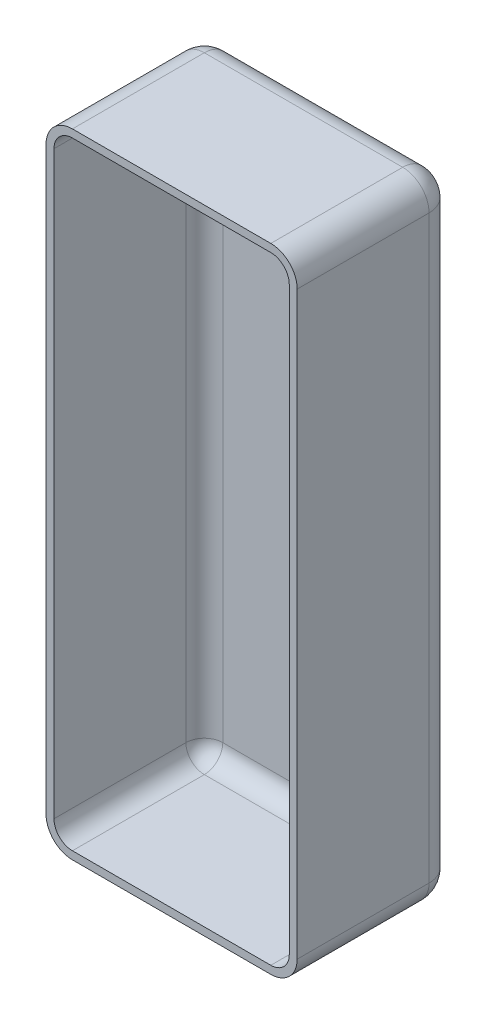
ISO-10303-21;
HEADER;
FILE_DESCRIPTION(('STEP AP214'),'2;1');
FILE_NAME('part.step','',(''),(''),'','','');
FILE_SCHEMA(('AUTOMOTIVE_DESIGN { 1 0 10303 214 1 1 1 1 }'));
ENDSEC;
DATA;
#1=APPLICATION_CONTEXT('core data for automotive mechanical design processes');
#2=APPLICATION_PROTOCOL_DEFINITION('international standard','automotive_design',2000,#1);
#3=PRODUCT_CONTEXT('',#1,'mechanical');
#4=PRODUCT('Part','Part','',(#3));
#5=PRODUCT_RELATED_PRODUCT_CATEGORY('part','',(#4));
#6=PRODUCT_DEFINITION_FORMATION('','',#4);
#7=PRODUCT_DEFINITION_CONTEXT('part definition',#1,'design');
#8=PRODUCT_DEFINITION('design','',#6,#7);
#9=PRODUCT_DEFINITION_SHAPE('','',#8);
#10=(LENGTH_UNIT() NAMED_UNIT(*) SI_UNIT(.MILLI.,.METRE.));
#11=(NAMED_UNIT(*) PLANE_ANGLE_UNIT() SI_UNIT($,.RADIAN.));
#12=(NAMED_UNIT(*) SI_UNIT($,.STERADIAN.) SOLID_ANGLE_UNIT());
#13=UNCERTAINTY_MEASURE_WITH_UNIT(LENGTH_MEASURE(1.E-05),#10,'distance_accuracy_value','');
#14=(GEOMETRIC_REPRESENTATION_CONTEXT(3) GLOBAL_UNCERTAINTY_ASSIGNED_CONTEXT((#13)) GLOBAL_UNIT_ASSIGNED_CONTEXT((#10,
#11,#12)) REPRESENTATION_CONTEXT('',''));
#15=CARTESIAN_POINT('',(0.,0.,0.));
#16=DIRECTION('',(0.,0.,1.));
#17=DIRECTION('',(1.,0.,0.));
#18=AXIS2_PLACEMENT_3D('',#15,#16,#17);
#19=CARTESIAN_POINT('',(-47.6,120.,60.));
#20=DIRECTION('',(1.,0.,0.));
#21=DIRECTION('',(0.,1.,0.));
#22=AXIS2_PLACEMENT_3D('',#19,#20,#21);
#23=PLANE('',#22);
#24=DIRECTION('',(0.,-1.,0.));
#25=VECTOR('',#24,1.);
#26=CARTESIAN_POINT('',(-47.6,120.,10.));
#27=LINE('',#26,#25);
#28=CARTESIAN_POINT('',(-47.6,110.,10.));
#29=VERTEX_POINT('',#28);
#30=CARTESIAN_POINT('',(-47.6,-110.,10.));
#31=VERTEX_POINT('',#30);
#32=EDGE_CURVE('E58',#29,#31,#27,.T.);
#33=ORIENTED_EDGE('',*,*,#32,.T.);
#34=DIRECTION('',(0.,0.,-1.));
#35=VECTOR('',#34,1.);
#36=CARTESIAN_POINT('',(-47.6,-110.,60.));
#37=LINE('',#36,#35);
#38=CARTESIAN_POINT('',(-47.6,-110.,60.));
#39=VERTEX_POINT('',#38);
#40=EDGE_CURVE('E286',#31,#39,#37,.F.);
#41=ORIENTED_EDGE('',*,*,#40,.T.);
#42=DIRECTION('',(0.,-1.,0.));
#43=VECTOR('',#42,1.);
#44=CARTESIAN_POINT('',(-47.6,120.,60.));
#45=LINE('',#44,#43);
#46=CARTESIAN_POINT('',(-47.6,110.,60.));
#47=VERTEX_POINT('',#46);
#48=EDGE_CURVE('E243',#47,#39,#45,.T.);
#49=ORIENTED_EDGE('',*,*,#48,.F.);
#50=DIRECTION('',(0.,0.,-1.));
#51=VECTOR('',#50,1.);
#52=CARTESIAN_POINT('',(-47.6,110.,60.));
#53=LINE('',#52,#51);
#54=EDGE_CURVE('E283',#47,#29,#53,.T.);
#55=ORIENTED_EDGE('',*,*,#54,.T.);
#56=EDGE_LOOP('',(#33,#41,#49,#55));
#57=FACE_BOUND('',#56,.T.);
#58=ADVANCED_FACE('F33',(#57),#23,.F.);
#59=CARTESIAN_POINT('',(-47.6,-120.,60.));
#60=DIRECTION('',(0.,1.,0.));
#61=DIRECTION('',(-1.,0.,0.));
#62=AXIS2_PLACEMENT_3D('',#59,#60,#61);
#63=PLANE('',#62);
#64=DIRECTION('',(1.,0.,0.));
#65=VECTOR('',#64,1.);
#66=CARTESIAN_POINT('',(-47.6,-120.,60.));
#67=LINE('',#66,#65);
#68=CARTESIAN_POINT('',(-37.6,-120.,60.));
#69=VERTEX_POINT('',#68);
#70=CARTESIAN_POINT('',(37.6,-120.,60.));
#71=VERTEX_POINT('',#70);
#72=EDGE_CURVE('E246',#69,#71,#67,.T.);
#73=ORIENTED_EDGE('',*,*,#72,.F.);
#74=DIRECTION('',(0.,0.,-1.));
#75=VECTOR('',#74,1.);
#76=CARTESIAN_POINT('',(-37.6,-120.,60.));
#77=LINE('',#76,#75);
#78=CARTESIAN_POINT('',(-37.6,-120.,10.));
#79=VERTEX_POINT('',#78);
#80=EDGE_CURVE('E260',#69,#79,#77,.T.);
#81=ORIENTED_EDGE('',*,*,#80,.T.);
#82=DIRECTION('',(1.,0.,0.));
#83=VECTOR('',#82,1.);
#84=CARTESIAN_POINT('',(-47.6,-120.,10.));
#85=LINE('',#84,#83);
#86=CARTESIAN_POINT('',(37.6,-120.,10.));
#87=VERTEX_POINT('',#86);
#88=EDGE_CURVE('E257',#79,#87,#85,.T.);
#89=ORIENTED_EDGE('',*,*,#88,.T.);
#90=DIRECTION('',(0.,0.,-1.));
#91=VECTOR('',#90,1.);
#92=CARTESIAN_POINT('',(37.6,-120.,60.));
#93=LINE('',#92,#91);
#94=EDGE_CURVE('E255',#87,#71,#93,.F.);
#95=ORIENTED_EDGE('',*,*,#94,.T.);
#96=EDGE_LOOP('',(#73,#81,#89,#95));
#97=FACE_BOUND('',#96,.T.);
#98=ADVANCED_FACE('F385',(#97),#63,.F.);
#99=CARTESIAN_POINT('',(47.6,120.,60.));
#100=DIRECTION('',(-1.,0.,0.));
#101=DIRECTION('',(0.,-1.,0.));
#102=AXIS2_PLACEMENT_3D('',#99,#100,#101);
#103=PLANE('',#102);
#104=DIRECTION('',(0.,1.,0.));
#105=VECTOR('',#104,1.);
#106=CARTESIAN_POINT('',(47.6,120.,60.));
#107=LINE('',#106,#105);
#108=CARTESIAN_POINT('',(47.6,-110.,60.));
#109=VERTEX_POINT('',#108);
#110=CARTESIAN_POINT('',(47.6,110.,60.));
#111=VERTEX_POINT('',#110);
#112=EDGE_CURVE('E249',#109,#111,#107,.T.);
#113=ORIENTED_EDGE('',*,*,#112,.F.);
#114=DIRECTION('',(0.,0.,-1.));
#115=VECTOR('',#114,1.);
#116=CARTESIAN_POINT('',(47.6,-110.,60.));
#117=LINE('',#116,#115);
#118=CARTESIAN_POINT('',(47.6,-110.,10.));
#119=VERTEX_POINT('',#118);
#120=EDGE_CURVE('E281',#109,#119,#117,.T.);
#121=ORIENTED_EDGE('',*,*,#120,.T.);
#122=DIRECTION('',(0.,1.,0.));
#123=VECTOR('',#122,1.);
#124=CARTESIAN_POINT('',(47.6,120.,10.));
#125=LINE('',#124,#123);
#126=CARTESIAN_POINT('',(47.6,110.,10.));
#127=VERTEX_POINT('',#126);
#128=EDGE_CURVE('E279',#119,#127,#125,.T.);
#129=ORIENTED_EDGE('',*,*,#128,.T.);
#130=DIRECTION('',(0.,0.,-1.));
#131=VECTOR('',#130,1.);
#132=CARTESIAN_POINT('',(47.6,110.,60.));
#133=LINE('',#132,#131);
#134=EDGE_CURVE('E277',#127,#111,#133,.F.);
#135=ORIENTED_EDGE('',*,*,#134,.T.);
#136=EDGE_LOOP('',(#113,#121,#129,#135));
#137=FACE_BOUND('',#136,.T.);
#138=ADVANCED_FACE('F388',(#137),#103,.F.);
#139=CARTESIAN_POINT('',(-47.6,120.,60.));
#140=DIRECTION('',(0.,-1.,0.));
#141=DIRECTION('',(0.,0.,-1.));
#142=AXIS2_PLACEMENT_3D('',#139,#140,#141);
#143=PLANE('',#142);
#144=DIRECTION('',(-1.,0.,0.));
#145=VECTOR('',#144,1.);
#146=CARTESIAN_POINT('',(-47.6,120.,10.));
#147=LINE('',#146,#145);
#148=CARTESIAN_POINT('',(37.6,120.,10.));
#149=VERTEX_POINT('',#148);
#150=CARTESIAN_POINT('',(-37.6,120.,10.));
#151=VERTEX_POINT('',#150);
#152=EDGE_CURVE('E273',#149,#151,#147,.T.);
#153=ORIENTED_EDGE('',*,*,#152,.T.);
#154=DIRECTION('',(0.,0.,-1.));
#155=VECTOR('',#154,1.);
#156=CARTESIAN_POINT('',(-37.6,120.,60.));
#157=LINE('',#156,#155);
#158=CARTESIAN_POINT('',(-37.6,120.,60.));
#159=VERTEX_POINT('',#158);
#160=EDGE_CURVE('E275',#151,#159,#157,.F.);
#161=ORIENTED_EDGE('',*,*,#160,.T.);
#162=DIRECTION('',(-1.,0.,0.));
#163=VECTOR('',#162,1.);
#164=CARTESIAN_POINT('',(-47.6,120.,60.));
#165=LINE('',#164,#163);
#166=CARTESIAN_POINT('',(37.6,120.,60.));
#167=VERTEX_POINT('',#166);
#168=EDGE_CURVE('E252',#167,#159,#165,.T.);
#169=ORIENTED_EDGE('',*,*,#168,.F.);
#170=DIRECTION('',(0.,0.,-1.));
#171=VECTOR('',#170,1.);
#172=CARTESIAN_POINT('',(37.6,120.,60.));
#173=LINE('',#172,#171);
#174=EDGE_CURVE('E271',#167,#149,#173,.T.);
#175=ORIENTED_EDGE('',*,*,#174,.T.);
#176=EDGE_LOOP('',(#153,#161,#169,#175));
#177=FACE_BOUND('',#176,.T.);
#178=ADVANCED_FACE('F353',(#177),#143,.F.);
#179=CARTESIAN_POINT('',(0.,0.,60.));
#180=DIRECTION('',(0.,0.,1.));
#181=DIRECTION('',(1.,0.,0.));
#182=AXIS2_PLACEMENT_3D('',#179,#180,#181);
#183=PLANE('',#182);
#184=DIRECTION('',(0.,-1.,0.));
#185=VECTOR('',#184,1.);
#186=CARTESIAN_POINT('',(-44.6,120.,60.));
#187=LINE('',#186,#185);
#188=CARTESIAN_POINT('',(-44.6,110.,60.));
#189=VERTEX_POINT('',#188);
#190=CARTESIAN_POINT('',(-44.6,-110.,60.));
#191=VERTEX_POINT('',#190);
#192=EDGE_CURVE('E190',#189,#191,#187,.T.);
#193=ORIENTED_EDGE('',*,*,#192,.F.);
#194=CARTESIAN_POINT('',(-37.6,110.,60.));
#195=DIRECTION('',(0.,0.,1.));
#196=DIRECTION('',(1.,0.,0.));
#197=AXIS2_PLACEMENT_3D('',#194,#195,#196);
#198=CIRCLE('',#197,7.);
#199=CARTESIAN_POINT('',(-37.6,117.,60.));
#200=VERTEX_POINT('',#199);
#201=EDGE_CURVE('E237',#200,#189,#198,.T.);
#202=ORIENTED_EDGE('',*,*,#201,.F.);
#203=DIRECTION('',(-1.,0.,0.));
#204=VECTOR('',#203,1.);
#205=CARTESIAN_POINT('',(-47.6,117.,60.));
#206=LINE('',#205,#204);
#207=CARTESIAN_POINT('',(37.6,117.,60.));
#208=VERTEX_POINT('',#207);
#209=EDGE_CURVE('E50',#208,#200,#206,.T.);
#210=ORIENTED_EDGE('',*,*,#209,.F.);
#211=CARTESIAN_POINT('',(37.6,110.,60.));
#212=DIRECTION('',(0.,0.,1.));
#213=DIRECTION('',(1.,0.,0.));
#214=AXIS2_PLACEMENT_3D('',#211,#212,#213);
#215=CIRCLE('',#214,7.);
#216=CARTESIAN_POINT('',(44.6,110.,60.));
#217=VERTEX_POINT('',#216);
#218=EDGE_CURVE('E194',#217,#208,#215,.T.);
#219=ORIENTED_EDGE('',*,*,#218,.F.);
#220=DIRECTION('',(0.,1.,0.));
#221=VECTOR('',#220,1.);
#222=CARTESIAN_POINT('',(44.6,120.,60.));
#223=LINE('',#222,#221);
#224=CARTESIAN_POINT('',(44.6,-110.,60.));
#225=VERTEX_POINT('',#224);
#226=EDGE_CURVE('E235',#225,#217,#223,.T.);
#227=ORIENTED_EDGE('',*,*,#226,.F.);
#228=CARTESIAN_POINT('',(37.6,-110.,60.));
#229=DIRECTION('',(0.,0.,1.));
#230=DIRECTION('',(1.,0.,0.));
#231=AXIS2_PLACEMENT_3D('',#228,#229,#230);
#232=CIRCLE('',#231,7.);
#233=CARTESIAN_POINT('',(37.6,-117.,60.));
#234=VERTEX_POINT('',#233);
#235=EDGE_CURVE('E232',#234,#225,#232,.T.);
#236=ORIENTED_EDGE('',*,*,#235,.F.);
#237=DIRECTION('',(1.,0.,0.));
#238=VECTOR('',#237,1.);
#239=CARTESIAN_POINT('',(-47.6,-117.,60.));
#240=LINE('',#239,#238);
#241=CARTESIAN_POINT('',(-37.6,-117.,60.));
#242=VERTEX_POINT('',#241);
#243=EDGE_CURVE('E227',#242,#234,#240,.T.);
#244=ORIENTED_EDGE('',*,*,#243,.F.);
#245=CARTESIAN_POINT('',(-37.6,-110.,60.));
#246=DIRECTION('',(0.,0.,1.));
#247=DIRECTION('',(1.,0.,0.));
#248=AXIS2_PLACEMENT_3D('',#245,#246,#247);
#249=CIRCLE('',#248,7.);
#250=EDGE_CURVE('E229',#191,#242,#249,.T.);
#251=ORIENTED_EDGE('',*,*,#250,.F.);
#252=EDGE_LOOP('',(#193,#202,#210,#219,#227,#236,#244,#251));
#253=FACE_BOUND('',#252,.T.);
#254=ORIENTED_EDGE('',*,*,#48,.T.);
#255=CARTESIAN_POINT('',(-37.6,-110.,60.));
#256=DIRECTION('',(0.,0.,1.));
#257=DIRECTION('',(1.,0.,0.));
#258=AXIS2_PLACEMENT_3D('',#255,#256,#257);
#259=CIRCLE('',#258,10.);
#260=EDGE_CURVE('E11',#39,#69,#259,.T.);
#261=ORIENTED_EDGE('',*,*,#260,.T.);
#262=ORIENTED_EDGE('',*,*,#72,.T.);
#263=CARTESIAN_POINT('',(37.6,-110.,60.));
#264=DIRECTION('',(0.,0.,1.));
#265=DIRECTION('',(1.,0.,0.));
#266=AXIS2_PLACEMENT_3D('',#263,#264,#265);
#267=CIRCLE('',#266,10.);
#268=EDGE_CURVE('E42',#71,#109,#267,.T.);
#269=ORIENTED_EDGE('',*,*,#268,.T.);
#270=ORIENTED_EDGE('',*,*,#112,.T.);
#271=CARTESIAN_POINT('',(37.6,110.,60.));
#272=DIRECTION('',(0.,0.,1.));
#273=DIRECTION('',(1.,0.,0.));
#274=AXIS2_PLACEMENT_3D('',#271,#272,#273);
#275=CIRCLE('',#274,10.);
#276=EDGE_CURVE('E288',#111,#167,#275,.T.);
#277=ORIENTED_EDGE('',*,*,#276,.T.);
#278=ORIENTED_EDGE('',*,*,#168,.T.);
#279=CARTESIAN_POINT('',(-37.6,110.,60.));
#280=DIRECTION('',(0.,0.,1.));
#281=DIRECTION('',(1.,0.,0.));
#282=AXIS2_PLACEMENT_3D('',#279,#280,#281);
#283=CIRCLE('',#282,10.);
#284=EDGE_CURVE('E290',#159,#47,#283,.T.);
#285=ORIENTED_EDGE('',*,*,#284,.T.);
#286=EDGE_LOOP('',(#254,#261,#262,#269,#270,#277,#278,#285));
#287=FACE_BOUND('',#286,.T.);
#288=ADVANCED_FACE('F346',(#253,#287),#183,.T.);
#289=CARTESIAN_POINT('',(0.,0.,0.));
#290=DIRECTION('',(0.,0.,1.));
#291=DIRECTION('',(1.,0.,0.));
#292=AXIS2_PLACEMENT_3D('',#289,#290,#291);
#293=PLANE('',#292);
#294=DIRECTION('',(-1.,0.,0.));
#295=VECTOR('',#294,1.);
#296=CARTESIAN_POINT('',(0.,110.,0.));
#297=LINE('',#296,#295);
#298=CARTESIAN_POINT('',(-37.6,110.,0.));
#299=VERTEX_POINT('',#298);
#300=CARTESIAN_POINT('',(37.6,110.,0.));
#301=VERTEX_POINT('',#300);
#302=EDGE_CURVE('E264',#299,#301,#297,.F.);
#303=ORIENTED_EDGE('',*,*,#302,.T.);
#304=DIRECTION('',(0.,1.,0.));
#305=VECTOR('',#304,1.);
#306=CARTESIAN_POINT('',(37.6,0.,0.));
#307=LINE('',#306,#305);
#308=CARTESIAN_POINT('',(37.6,-110.,0.));
#309=VERTEX_POINT('',#308);
#310=EDGE_CURVE('E269',#301,#309,#307,.F.);
#311=ORIENTED_EDGE('',*,*,#310,.T.);
#312=DIRECTION('',(1.,0.,0.));
#313=VECTOR('',#312,1.);
#314=CARTESIAN_POINT('',(0.,-110.,0.));
#315=LINE('',#314,#313);
#316=CARTESIAN_POINT('',(-37.6,-110.,0.));
#317=VERTEX_POINT('',#316);
#318=EDGE_CURVE('E266',#309,#317,#315,.F.);
#319=ORIENTED_EDGE('',*,*,#318,.T.);
#320=DIRECTION('',(0.,-1.,0.));
#321=VECTOR('',#320,1.);
#322=CARTESIAN_POINT('',(-37.6,0.,0.));
#323=LINE('',#322,#321);
#324=EDGE_CURVE('E262',#317,#299,#323,.F.);
#325=ORIENTED_EDGE('',*,*,#324,.T.);
#326=EDGE_LOOP('',(#303,#311,#319,#325));
#327=FACE_BOUND('',#326,.T.);
#328=ADVANCED_FACE('F372',(#327),#293,.F.);
#329=CARTESIAN_POINT('',(-37.6,110.,60.));
#330=DIRECTION('',(0.,0.,-1.));
#331=DIRECTION('',(-1.,0.,0.));
#332=AXIS2_PLACEMENT_3D('',#329,#330,#331);
#333=CYLINDRICAL_SURFACE('',#332,10.);
#334=ORIENTED_EDGE('',*,*,#284,.F.);
#335=ORIENTED_EDGE('',*,*,#160,.F.);
#336=CARTESIAN_POINT('',(-37.6,110.,10.));
#337=DIRECTION('',(0.,0.,-1.));
#338=DIRECTION('',(-1.,0.,0.));
#339=AXIS2_PLACEMENT_3D('',#336,#337,#338);
#340=CIRCLE('',#339,10.);
#341=EDGE_CURVE('E319',#29,#151,#340,.T.);
#342=ORIENTED_EDGE('',*,*,#341,.F.);
#343=ORIENTED_EDGE('',*,*,#54,.F.);
#344=EDGE_LOOP('',(#334,#335,#342,#343));
#345=FACE_BOUND('',#344,.T.);
#346=ADVANCED_FACE('F35',(#345),#333,.T.);
#347=CARTESIAN_POINT('',(37.6,110.,60.));
#348=DIRECTION('',(0.,0.,-1.));
#349=DIRECTION('',(-1.,0.,0.));
#350=AXIS2_PLACEMENT_3D('',#347,#348,#349);
#351=CYLINDRICAL_SURFACE('',#350,10.);
#352=ORIENTED_EDGE('',*,*,#276,.F.);
#353=ORIENTED_EDGE('',*,*,#134,.F.);
#354=CARTESIAN_POINT('',(37.6,110.,10.));
#355=DIRECTION('',(0.,0.,-1.));
#356=DIRECTION('',(-1.,0.,0.));
#357=AXIS2_PLACEMENT_3D('',#354,#355,#356);
#358=CIRCLE('',#357,10.);
#359=EDGE_CURVE('E317',#149,#127,#358,.T.);
#360=ORIENTED_EDGE('',*,*,#359,.F.);
#361=ORIENTED_EDGE('',*,*,#174,.F.);
#362=EDGE_LOOP('',(#352,#353,#360,#361));
#363=FACE_BOUND('',#362,.T.);
#364=ADVANCED_FACE('F362',(#363),#351,.T.);
#365=CARTESIAN_POINT('',(-47.6,110.,10.));
#366=DIRECTION('',(-1.,0.,0.));
#367=DIRECTION('',(0.,0.,1.));
#368=AXIS2_PLACEMENT_3D('',#365,#366,#367);
#369=CYLINDRICAL_SURFACE('',#368,10.);
#370=CARTESIAN_POINT('',(-37.6,110.,10.));
#371=DIRECTION('',(-1.,0.,0.));
#372=DIRECTION('',(0.,0.,1.));
#373=AXIS2_PLACEMENT_3D('',#370,#371,#372);
#374=CIRCLE('',#373,10.);
#375=EDGE_CURVE('E37',#151,#299,#374,.T.);
#376=ORIENTED_EDGE('',*,*,#375,.F.);
#377=ORIENTED_EDGE('',*,*,#152,.F.);
#378=CARTESIAN_POINT('',(37.6,110.,10.));
#379=DIRECTION('',(1.,0.,0.));
#380=DIRECTION('',(0.,1.,0.));
#381=AXIS2_PLACEMENT_3D('',#378,#379,#380);
#382=CIRCLE('',#381,10.);
#383=EDGE_CURVE('E314',#301,#149,#382,.T.);
#384=ORIENTED_EDGE('',*,*,#383,.F.);
#385=ORIENTED_EDGE('',*,*,#302,.F.);
#386=EDGE_LOOP('',(#376,#377,#384,#385));
#387=FACE_BOUND('',#386,.T.);
#388=ADVANCED_FACE('F357',(#387),#369,.T.);
#389=CARTESIAN_POINT('',(-37.6,110.,10.));
#390=DIRECTION('',(0.,0.,1.));
#391=DIRECTION('',(1.,0.,0.));
#392=AXIS2_PLACEMENT_3D('',#389,#390,#391);
#393=SPHERICAL_SURFACE('',#392,10.);
#394=ORIENTED_EDGE('',*,*,#341,.T.);
#395=ORIENTED_EDGE('',*,*,#375,.T.);
#396=CARTESIAN_POINT('',(-37.6,110.,10.));
#397=DIRECTION('',(0.,1.,0.));
#398=DIRECTION('',(0.,0.,1.));
#399=AXIS2_PLACEMENT_3D('',#396,#397,#398);
#400=CIRCLE('',#399,10.);
#401=EDGE_CURVE('E311',#29,#299,#400,.F.);
#402=ORIENTED_EDGE('',*,*,#401,.F.);
#403=EDGE_LOOP('',(#394,#395,#402));
#404=FACE_BOUND('',#403,.T.);
#405=ADVANCED_FACE('F326',(#404),#393,.T.);
#406=CARTESIAN_POINT('',(37.6,110.,10.));
#407=DIRECTION('',(0.,0.,1.));
#408=DIRECTION('',(1.,0.,0.));
#409=AXIS2_PLACEMENT_3D('',#406,#407,#408);
#410=SPHERICAL_SURFACE('',#409,10.);
#411=ORIENTED_EDGE('',*,*,#383,.T.);
#412=ORIENTED_EDGE('',*,*,#359,.T.);
#413=CARTESIAN_POINT('',(37.6,110.,10.));
#414=DIRECTION('',(0.,1.,0.));
#415=DIRECTION('',(0.,0.,1.));
#416=AXIS2_PLACEMENT_3D('',#413,#414,#415);
#417=CIRCLE('',#416,10.);
#418=EDGE_CURVE('E308',#301,#127,#417,.F.);
#419=ORIENTED_EDGE('',*,*,#418,.F.);
#420=EDGE_LOOP('',(#411,#412,#419));
#421=FACE_BOUND('',#420,.T.);
#422=ADVANCED_FACE('F364',(#421),#410,.T.);
#423=CARTESIAN_POINT('',(-37.6,120.,10.));
#424=DIRECTION('',(0.,-1.,0.));
#425=DIRECTION('',(1.,0.,0.));
#426=AXIS2_PLACEMENT_3D('',#423,#424,#425);
#427=CYLINDRICAL_SURFACE('',#426,10.);
#428=ORIENTED_EDGE('',*,*,#401,.T.);
#429=ORIENTED_EDGE('',*,*,#324,.F.);
#430=CARTESIAN_POINT('',(-37.6,-110.,10.));
#431=DIRECTION('',(0.,-1.,0.));
#432=DIRECTION('',(0.,0.,-1.));
#433=AXIS2_PLACEMENT_3D('',#430,#431,#432);
#434=CIRCLE('',#433,10.);
#435=EDGE_CURVE('E305',#31,#317,#434,.T.);
#436=ORIENTED_EDGE('',*,*,#435,.F.);
#437=ORIENTED_EDGE('',*,*,#32,.F.);
#438=EDGE_LOOP('',(#428,#429,#436,#437));
#439=FACE_BOUND('',#438,.T.);
#440=ADVANCED_FACE('F332',(#439),#427,.T.);
#441=CARTESIAN_POINT('',(-37.6,-110.,60.));
#442=DIRECTION('',(0.,0.,-1.));
#443=DIRECTION('',(-1.,0.,0.));
#444=AXIS2_PLACEMENT_3D('',#441,#442,#443);
#445=CYLINDRICAL_SURFACE('',#444,10.);
#446=ORIENTED_EDGE('',*,*,#260,.F.);
#447=ORIENTED_EDGE('',*,*,#40,.F.);
#448=CARTESIAN_POINT('',(-37.6,-110.,10.));
#449=DIRECTION('',(0.,0.,-1.));
#450=DIRECTION('',(-1.,0.,0.));
#451=AXIS2_PLACEMENT_3D('',#448,#449,#450);
#452=CIRCLE('',#451,10.);
#453=EDGE_CURVE('E302',#79,#31,#452,.T.);
#454=ORIENTED_EDGE('',*,*,#453,.F.);
#455=ORIENTED_EDGE('',*,*,#80,.F.);
#456=EDGE_LOOP('',(#446,#447,#454,#455));
#457=FACE_BOUND('',#456,.T.);
#458=ADVANCED_FACE('F342',(#457),#445,.T.);
#459=CARTESIAN_POINT('',(37.6,-110.,60.));
#460=DIRECTION('',(0.,0.,-1.));
#461=DIRECTION('',(-1.,0.,0.));
#462=AXIS2_PLACEMENT_3D('',#459,#460,#461);
#463=CYLINDRICAL_SURFACE('',#462,10.);
#464=ORIENTED_EDGE('',*,*,#268,.F.);
#465=ORIENTED_EDGE('',*,*,#94,.F.);
#466=CARTESIAN_POINT('',(37.6,-110.,10.));
#467=DIRECTION('',(0.,0.,-1.));
#468=DIRECTION('',(-1.,0.,0.));
#469=AXIS2_PLACEMENT_3D('',#466,#467,#468);
#470=CIRCLE('',#469,10.);
#471=EDGE_CURVE('E299',#119,#87,#470,.T.);
#472=ORIENTED_EDGE('',*,*,#471,.F.);
#473=ORIENTED_EDGE('',*,*,#120,.F.);
#474=EDGE_LOOP('',(#464,#465,#472,#473));
#475=FACE_BOUND('',#474,.T.);
#476=ADVANCED_FACE('F383',(#475),#463,.T.);
#477=CARTESIAN_POINT('',(37.6,120.,10.));
#478=DIRECTION('',(0.,1.,0.));
#479=DIRECTION('',(-1.,0.,0.));
#480=AXIS2_PLACEMENT_3D('',#477,#478,#479);
#481=CYLINDRICAL_SURFACE('',#480,10.);
#482=ORIENTED_EDGE('',*,*,#418,.T.);
#483=ORIENTED_EDGE('',*,*,#128,.F.);
#484=CARTESIAN_POINT('',(37.6,-110.,10.));
#485=DIRECTION('',(0.,-1.,0.));
#486=DIRECTION('',(0.,0.,-1.));
#487=AXIS2_PLACEMENT_3D('',#484,#485,#486);
#488=CIRCLE('',#487,10.);
#489=EDGE_CURVE('E296',#309,#119,#488,.T.);
#490=ORIENTED_EDGE('',*,*,#489,.F.);
#491=ORIENTED_EDGE('',*,*,#310,.F.);
#492=EDGE_LOOP('',(#482,#483,#490,#491));
#493=FACE_BOUND('',#492,.T.);
#494=ADVANCED_FACE('F369',(#493),#481,.T.);
#495=CARTESIAN_POINT('',(-37.6,-110.,10.));
#496=DIRECTION('',(0.,0.,1.));
#497=DIRECTION('',(1.,0.,0.));
#498=AXIS2_PLACEMENT_3D('',#495,#496,#497);
#499=SPHERICAL_SURFACE('',#498,10.);
#500=ORIENTED_EDGE('',*,*,#453,.T.);
#501=ORIENTED_EDGE('',*,*,#435,.T.);
#502=CARTESIAN_POINT('',(-37.6,-110.,10.));
#503=DIRECTION('',(-1.,0.,0.));
#504=DIRECTION('',(0.,0.,1.));
#505=AXIS2_PLACEMENT_3D('',#502,#503,#504);
#506=CIRCLE('',#505,10.);
#507=EDGE_CURVE('E294',#79,#317,#506,.F.);
#508=ORIENTED_EDGE('',*,*,#507,.F.);
#509=EDGE_LOOP('',(#500,#501,#508));
#510=FACE_BOUND('',#509,.T.);
#511=ADVANCED_FACE('F337',(#510),#499,.T.);
#512=CARTESIAN_POINT('',(37.6,-110.,10.));
#513=DIRECTION('',(0.,0.,1.));
#514=DIRECTION('',(1.,0.,0.));
#515=AXIS2_PLACEMENT_3D('',#512,#513,#514);
#516=SPHERICAL_SURFACE('',#515,10.);
#517=ORIENTED_EDGE('',*,*,#489,.T.);
#518=ORIENTED_EDGE('',*,*,#471,.T.);
#519=CARTESIAN_POINT('',(37.6,-110.,10.));
#520=DIRECTION('',(1.,0.,0.));
#521=DIRECTION('',(0.,0.,-1.));
#522=AXIS2_PLACEMENT_3D('',#519,#520,#521);
#523=CIRCLE('',#522,10.);
#524=EDGE_CURVE('E231',#309,#87,#523,.F.);
#525=ORIENTED_EDGE('',*,*,#524,.F.);
#526=EDGE_LOOP('',(#517,#518,#525));
#527=FACE_BOUND('',#526,.T.);
#528=ADVANCED_FACE('F377',(#527),#516,.T.);
#529=CARTESIAN_POINT('',(-47.6,-110.,10.));
#530=DIRECTION('',(1.,0.,0.));
#531=DIRECTION('',(0.,1.,0.));
#532=AXIS2_PLACEMENT_3D('',#529,#530,#531);
#533=CYLINDRICAL_SURFACE('',#532,10.);
#534=ORIENTED_EDGE('',*,*,#507,.T.);
#535=ORIENTED_EDGE('',*,*,#318,.F.);
#536=ORIENTED_EDGE('',*,*,#524,.T.);
#537=ORIENTED_EDGE('',*,*,#88,.F.);
#538=EDGE_LOOP('',(#534,#535,#536,#537));
#539=FACE_BOUND('',#538,.T.);
#540=ADVANCED_FACE('F375',(#539),#533,.T.);
#541=CARTESIAN_POINT('',(-44.6,120.,60.));
#542=DIRECTION('',(1.,0.,0.));
#543=DIRECTION('',(0.,1.,0.));
#544=AXIS2_PLACEMENT_3D('',#541,#542,#543);
#545=PLANE('',#544);
#546=DIRECTION('',(0.,1.,0.));
#547=VECTOR('',#546,1.);
#548=CARTESIAN_POINT('',(-44.6,120.,10.));
#549=LINE('',#548,#547);
#550=CARTESIAN_POINT('',(-44.6,110.,10.));
#551=VERTEX_POINT('',#550);
#552=CARTESIAN_POINT('',(-44.6,-110.,10.));
#553=VERTEX_POINT('',#552);
#554=EDGE_CURVE('E174',#551,#553,#549,.F.);
#555=ORIENTED_EDGE('',*,*,#554,.F.);
#556=DIRECTION('',(0.,0.,1.));
#557=VECTOR('',#556,1.);
#558=CARTESIAN_POINT('',(-44.6,110.,60.));
#559=LINE('',#558,#557);
#560=EDGE_CURVE('E185',#189,#551,#559,.F.);
#561=ORIENTED_EDGE('',*,*,#560,.F.);
#562=ORIENTED_EDGE('',*,*,#192,.T.);
#563=DIRECTION('',(0.,0.,1.));
#564=VECTOR('',#563,1.);
#565=CARTESIAN_POINT('',(-44.6,-110.,60.));
#566=LINE('',#565,#564);
#567=EDGE_CURVE('E184',#553,#191,#566,.T.);
#568=ORIENTED_EDGE('',*,*,#567,.F.);
#569=EDGE_LOOP('',(#555,#561,#562,#568));
#570=FACE_BOUND('',#569,.T.);
#571=ADVANCED_FACE('F188',(#570),#545,.T.);
#572=CARTESIAN_POINT('',(-47.6,-117.,60.));
#573=DIRECTION('',(0.,1.,0.));
#574=DIRECTION('',(-1.,0.,0.));
#575=AXIS2_PLACEMENT_3D('',#572,#573,#574);
#576=PLANE('',#575);
#577=ORIENTED_EDGE('',*,*,#243,.T.);
#578=DIRECTION('',(0.,0.,1.));
#579=VECTOR('',#578,1.);
#580=CARTESIAN_POINT('',(37.6,-117.,60.));
#581=LINE('',#580,#579);
#582=CARTESIAN_POINT('',(37.6,-117.,10.));
#583=VERTEX_POINT('',#582);
#584=EDGE_CURVE('E219',#583,#234,#581,.T.);
#585=ORIENTED_EDGE('',*,*,#584,.F.);
#586=DIRECTION('',(-1.,0.,0.));
#587=VECTOR('',#586,1.);
#588=CARTESIAN_POINT('',(-47.6,-117.,10.));
#589=LINE('',#588,#587);
#590=CARTESIAN_POINT('',(-37.6,-117.,10.));
#591=VERTEX_POINT('',#590);
#592=EDGE_CURVE('E216',#591,#583,#589,.F.);
#593=ORIENTED_EDGE('',*,*,#592,.F.);
#594=DIRECTION('',(0.,0.,1.));
#595=VECTOR('',#594,1.);
#596=CARTESIAN_POINT('',(-37.6,-117.,60.));
#597=LINE('',#596,#595);
#598=EDGE_CURVE('E206',#242,#591,#597,.F.);
#599=ORIENTED_EDGE('',*,*,#598,.F.);
#600=EDGE_LOOP('',(#577,#585,#593,#599));
#601=FACE_BOUND('',#600,.T.);
#602=ADVANCED_FACE('F487',(#601),#576,.T.);
#603=CARTESIAN_POINT('',(44.6,120.,60.));
#604=DIRECTION('',(-1.,0.,0.));
#605=DIRECTION('',(0.,-1.,0.));
#606=AXIS2_PLACEMENT_3D('',#603,#604,#605);
#607=PLANE('',#606);
#608=ORIENTED_EDGE('',*,*,#226,.T.);
#609=DIRECTION('',(0.,0.,1.));
#610=VECTOR('',#609,1.);
#611=CARTESIAN_POINT('',(44.6,110.,60.));
#612=LINE('',#611,#610);
#613=CARTESIAN_POINT('',(44.6,110.,10.));
#614=VERTEX_POINT('',#613);
#615=EDGE_CURVE('E707',#614,#217,#612,.T.);
#616=ORIENTED_EDGE('',*,*,#615,.F.);
#617=DIRECTION('',(0.,-1.,0.));
#618=VECTOR('',#617,1.);
#619=CARTESIAN_POINT('',(44.6,120.,10.));
#620=LINE('',#619,#618);
#621=CARTESIAN_POINT('',(44.6,-110.,10.));
#622=VERTEX_POINT('',#621);
#623=EDGE_CURVE('E703',#622,#614,#620,.F.);
#624=ORIENTED_EDGE('',*,*,#623,.F.);
#625=DIRECTION('',(0.,0.,1.));
#626=VECTOR('',#625,1.);
#627=CARTESIAN_POINT('',(44.6,-110.,60.));
#628=LINE('',#627,#626);
#629=EDGE_CURVE('E700',#225,#622,#628,.F.);
#630=ORIENTED_EDGE('',*,*,#629,.F.);
#631=EDGE_LOOP('',(#608,#616,#624,#630));
#632=FACE_BOUND('',#631,.T.);
#633=ADVANCED_FACE('F484',(#632),#607,.T.);
#634=CARTESIAN_POINT('',(-47.6,117.,60.));
#635=DIRECTION('',(0.,-1.,0.));
#636=DIRECTION('',(0.,0.,-1.));
#637=AXIS2_PLACEMENT_3D('',#634,#635,#636);
#638=PLANE('',#637);
#639=DIRECTION('',(1.,0.,0.));
#640=VECTOR('',#639,1.);
#641=CARTESIAN_POINT('',(-47.6,117.,10.));
#642=LINE('',#641,#640);
#643=CARTESIAN_POINT('',(37.6,117.,10.));
#644=VERTEX_POINT('',#643);
#645=CARTESIAN_POINT('',(-37.6,117.,10.));
#646=VERTEX_POINT('',#645);
#647=EDGE_CURVE('E737',#644,#646,#642,.F.);
#648=ORIENTED_EDGE('',*,*,#647,.F.);
#649=DIRECTION('',(0.,0.,-1.));
#650=VECTOR('',#649,1.);
#651=CARTESIAN_POINT('',(37.6,117.,60.));
#652=LINE('',#651,#650);
#653=EDGE_CURVE('E723',#208,#644,#652,.T.);
#654=ORIENTED_EDGE('',*,*,#653,.F.);
#655=ORIENTED_EDGE('',*,*,#209,.T.);
#656=DIRECTION('',(0.,0.,-1.));
#657=VECTOR('',#656,1.);
#658=CARTESIAN_POINT('',(-37.6,117.,60.));
#659=LINE('',#658,#657);
#660=EDGE_CURVE('E736',#646,#200,#659,.F.);
#661=ORIENTED_EDGE('',*,*,#660,.F.);
#662=EDGE_LOOP('',(#648,#654,#655,#661));
#663=FACE_BOUND('',#662,.T.);
#664=ADVANCED_FACE('F480',(#663),#638,.T.);
#665=CARTESIAN_POINT('',(0.,0.,3.));
#666=DIRECTION('',(0.,0.,1.));
#667=DIRECTION('',(1.,0.,0.));
#668=AXIS2_PLACEMENT_3D('',#665,#666,#667);
#669=PLANE('',#668);
#670=DIRECTION('',(1.,0.,0.));
#671=VECTOR('',#670,1.);
#672=CARTESIAN_POINT('',(0.,110.,3.));
#673=LINE('',#672,#671);
#674=CARTESIAN_POINT('',(-37.6,110.,3.));
#675=VERTEX_POINT('',#674);
#676=CARTESIAN_POINT('',(37.6,110.,3.));
#677=VERTEX_POINT('',#676);
#678=EDGE_CURVE('E718',#675,#677,#673,.T.);
#679=ORIENTED_EDGE('',*,*,#678,.F.);
#680=DIRECTION('',(0.,1.,0.));
#681=VECTOR('',#680,1.);
#682=CARTESIAN_POINT('',(-37.6,0.,3.));
#683=LINE('',#682,#681);
#684=CARTESIAN_POINT('',(-37.6,-110.,3.));
#685=VERTEX_POINT('',#684);
#686=EDGE_CURVE('E215',#685,#675,#683,.T.);
#687=ORIENTED_EDGE('',*,*,#686,.F.);
#688=DIRECTION('',(1.,0.,0.));
#689=VECTOR('',#688,1.);
#690=CARTESIAN_POINT('',(0.,-110.,3.));
#691=LINE('',#690,#689);
#692=CARTESIAN_POINT('',(37.6,-110.,3.));
#693=VERTEX_POINT('',#692);
#694=EDGE_CURVE('E720',#693,#685,#691,.F.);
#695=ORIENTED_EDGE('',*,*,#694,.F.);
#696=DIRECTION('',(0.,1.,0.));
#697=VECTOR('',#696,1.);
#698=CARTESIAN_POINT('',(37.6,0.,3.));
#699=LINE('',#698,#697);
#700=EDGE_CURVE('E721',#677,#693,#699,.F.);
#701=ORIENTED_EDGE('',*,*,#700,.F.);
#702=EDGE_LOOP('',(#679,#687,#695,#701));
#703=FACE_BOUND('',#702,.T.);
#704=ADVANCED_FACE('F476',(#703),#669,.T.);
#705=CARTESIAN_POINT('',(-37.6,110.,60.));
#706=DIRECTION('',(0.,0.,-1.));
#707=DIRECTION('',(-1.,0.,0.));
#708=AXIS2_PLACEMENT_3D('',#705,#706,#707);
#709=CYLINDRICAL_SURFACE('',#708,7.);
#710=ORIENTED_EDGE('',*,*,#201,.T.);
#711=ORIENTED_EDGE('',*,*,#560,.T.);
#712=CARTESIAN_POINT('',(-37.6,110.,10.));
#713=DIRECTION('',(0.,0.,1.));
#714=DIRECTION('',(1.,0.,0.));
#715=AXIS2_PLACEMENT_3D('',#712,#713,#714);
#716=CIRCLE('',#715,7.);
#717=EDGE_CURVE('E728',#551,#646,#716,.F.);
#718=ORIENTED_EDGE('',*,*,#717,.T.);
#719=ORIENTED_EDGE('',*,*,#660,.T.);
#720=EDGE_LOOP('',(#710,#711,#718,#719));
#721=FACE_BOUND('',#720,.T.);
#722=ADVANCED_FACE('F472',(#721),#709,.F.);
#723=CARTESIAN_POINT('',(37.6,110.,60.));
#724=DIRECTION('',(0.,0.,-1.));
#725=DIRECTION('',(-1.,0.,0.));
#726=AXIS2_PLACEMENT_3D('',#723,#724,#725);
#727=CYLINDRICAL_SURFACE('',#726,7.);
#728=ORIENTED_EDGE('',*,*,#218,.T.);
#729=ORIENTED_EDGE('',*,*,#653,.T.);
#730=CARTESIAN_POINT('',(37.6,110.,10.));
#731=DIRECTION('',(0.,0.,1.));
#732=DIRECTION('',(1.,0.,0.));
#733=AXIS2_PLACEMENT_3D('',#730,#731,#732);
#734=CIRCLE('',#733,7.);
#735=EDGE_CURVE('E710',#644,#614,#734,.F.);
#736=ORIENTED_EDGE('',*,*,#735,.T.);
#737=ORIENTED_EDGE('',*,*,#615,.T.);
#738=EDGE_LOOP('',(#728,#729,#736,#737));
#739=FACE_BOUND('',#738,.T.);
#740=ADVANCED_FACE('F468',(#739),#727,.F.);
#741=CARTESIAN_POINT('',(-47.6,110.,10.));
#742=DIRECTION('',(-1.,0.,0.));
#743=DIRECTION('',(0.,0.,1.));
#744=AXIS2_PLACEMENT_3D('',#741,#742,#743);
#745=CYLINDRICAL_SURFACE('',#744,7.);
#746=CARTESIAN_POINT('',(-37.6,110.,10.));
#747=DIRECTION('',(1.,0.,0.));
#748=DIRECTION('',(0.,1.,0.));
#749=AXIS2_PLACEMENT_3D('',#746,#747,#748);
#750=CIRCLE('',#749,7.);
#751=EDGE_CURVE('E228',#646,#675,#750,.F.);
#752=ORIENTED_EDGE('',*,*,#751,.T.);
#753=ORIENTED_EDGE('',*,*,#678,.T.);
#754=CARTESIAN_POINT('',(37.6,110.,10.));
#755=DIRECTION('',(1.,0.,0.));
#756=DIRECTION('',(0.,1.,0.));
#757=AXIS2_PLACEMENT_3D('',#754,#755,#756);
#758=CIRCLE('',#757,7.);
#759=EDGE_CURVE('E713',#677,#644,#758,.T.);
#760=ORIENTED_EDGE('',*,*,#759,.T.);
#761=ORIENTED_EDGE('',*,*,#647,.T.);
#762=EDGE_LOOP('',(#752,#753,#760,#761));
#763=FACE_BOUND('',#762,.T.);
#764=ADVANCED_FACE('F464',(#763),#745,.F.);
#765=CARTESIAN_POINT('',(-37.6,110.,10.));
#766=DIRECTION('',(0.,0.,1.));
#767=DIRECTION('',(1.,0.,0.));
#768=AXIS2_PLACEMENT_3D('',#765,#766,#767);
#769=SPHERICAL_SURFACE('',#768,7.);
#770=ORIENTED_EDGE('',*,*,#717,.F.);
#771=CARTESIAN_POINT('',(-37.6,110.,10.));
#772=DIRECTION('',(0.,-1.,0.));
#773=DIRECTION('',(1.,0.,0.));
#774=AXIS2_PLACEMENT_3D('',#771,#772,#773);
#775=CIRCLE('',#774,7.);
#776=EDGE_CURVE('E181',#551,#675,#775,.T.);
#777=ORIENTED_EDGE('',*,*,#776,.T.);
#778=ORIENTED_EDGE('',*,*,#751,.F.);
#779=EDGE_LOOP('',(#770,#777,#778));
#780=FACE_BOUND('',#779,.T.);
#781=ADVANCED_FACE('F460',(#780),#769,.F.);
#782=CARTESIAN_POINT('',(37.6,110.,10.));
#783=DIRECTION('',(0.,0.,1.));
#784=DIRECTION('',(1.,0.,0.));
#785=AXIS2_PLACEMENT_3D('',#782,#783,#784);
#786=SPHERICAL_SURFACE('',#785,7.);
#787=ORIENTED_EDGE('',*,*,#759,.F.);
#788=CARTESIAN_POINT('',(37.6,110.,10.));
#789=DIRECTION('',(0.,1.,0.));
#790=DIRECTION('',(-1.,0.,0.));
#791=AXIS2_PLACEMENT_3D('',#788,#789,#790);
#792=CIRCLE('',#791,7.);
#793=EDGE_CURVE('E202',#677,#614,#792,.F.);
#794=ORIENTED_EDGE('',*,*,#793,.T.);
#795=ORIENTED_EDGE('',*,*,#735,.F.);
#796=EDGE_LOOP('',(#787,#794,#795));
#797=FACE_BOUND('',#796,.T.);
#798=ADVANCED_FACE('F457',(#797),#786,.F.);
#799=CARTESIAN_POINT('',(-37.6,120.,10.));
#800=DIRECTION('',(0.,-1.,0.));
#801=DIRECTION('',(1.,0.,0.));
#802=AXIS2_PLACEMENT_3D('',#799,#800,#801);
#803=CYLINDRICAL_SURFACE('',#802,7.);
#804=ORIENTED_EDGE('',*,*,#776,.F.);
#805=ORIENTED_EDGE('',*,*,#554,.T.);
#806=CARTESIAN_POINT('',(-37.6,-110.,10.));
#807=DIRECTION('',(0.,1.,0.));
#808=DIRECTION('',(-1.,0.,0.));
#809=AXIS2_PLACEMENT_3D('',#806,#807,#808);
#810=CIRCLE('',#809,7.);
#811=EDGE_CURVE('E178',#553,#685,#810,.F.);
#812=ORIENTED_EDGE('',*,*,#811,.T.);
#813=ORIENTED_EDGE('',*,*,#686,.T.);
#814=EDGE_LOOP('',(#804,#805,#812,#813));
#815=FACE_BOUND('',#814,.T.);
#816=ADVANCED_FACE('F176',(#815),#803,.F.);
#817=CARTESIAN_POINT('',(-37.6,-110.,60.));
#818=DIRECTION('',(0.,0.,-1.));
#819=DIRECTION('',(-1.,0.,0.));
#820=AXIS2_PLACEMENT_3D('',#817,#818,#819);
#821=CYLINDRICAL_SURFACE('',#820,7.);
#822=ORIENTED_EDGE('',*,*,#250,.T.);
#823=ORIENTED_EDGE('',*,*,#598,.T.);
#824=CARTESIAN_POINT('',(-37.6,-110.,10.));
#825=DIRECTION('',(0.,0.,1.));
#826=DIRECTION('',(1.,0.,0.));
#827=AXIS2_PLACEMENT_3D('',#824,#825,#826);
#828=CIRCLE('',#827,7.);
#829=EDGE_CURVE('E199',#591,#553,#828,.F.);
#830=ORIENTED_EDGE('',*,*,#829,.T.);
#831=ORIENTED_EDGE('',*,*,#567,.T.);
#832=EDGE_LOOP('',(#822,#823,#830,#831));
#833=FACE_BOUND('',#832,.T.);
#834=ADVANCED_FACE('F204',(#833),#821,.F.);
#835=CARTESIAN_POINT('',(37.6,-110.,60.));
#836=DIRECTION('',(0.,0.,-1.));
#837=DIRECTION('',(-1.,0.,0.));
#838=AXIS2_PLACEMENT_3D('',#835,#836,#837);
#839=CYLINDRICAL_SURFACE('',#838,7.);
#840=ORIENTED_EDGE('',*,*,#235,.T.);
#841=ORIENTED_EDGE('',*,*,#629,.T.);
#842=CARTESIAN_POINT('',(37.6,-110.,10.));
#843=DIRECTION('',(0.,0.,1.));
#844=DIRECTION('',(1.,0.,0.));
#845=AXIS2_PLACEMENT_3D('',#842,#843,#844);
#846=CIRCLE('',#845,7.);
#847=EDGE_CURVE('E207',#622,#583,#846,.F.);
#848=ORIENTED_EDGE('',*,*,#847,.T.);
#849=ORIENTED_EDGE('',*,*,#584,.T.);
#850=EDGE_LOOP('',(#840,#841,#848,#849));
#851=FACE_BOUND('',#850,.T.);
#852=ADVANCED_FACE('F448',(#851),#839,.F.);
#853=CARTESIAN_POINT('',(37.6,120.,10.));
#854=DIRECTION('',(0.,1.,0.));
#855=DIRECTION('',(-1.,0.,0.));
#856=AXIS2_PLACEMENT_3D('',#853,#854,#855);
#857=CYLINDRICAL_SURFACE('',#856,7.);
#858=ORIENTED_EDGE('',*,*,#793,.F.);
#859=ORIENTED_EDGE('',*,*,#700,.T.);
#860=CARTESIAN_POINT('',(37.6,-110.,10.));
#861=DIRECTION('',(0.,-1.,0.));
#862=DIRECTION('',(0.,0.,-1.));
#863=AXIS2_PLACEMENT_3D('',#860,#861,#862);
#864=CIRCLE('',#863,7.);
#865=EDGE_CURVE('E210',#693,#622,#864,.T.);
#866=ORIENTED_EDGE('',*,*,#865,.T.);
#867=ORIENTED_EDGE('',*,*,#623,.T.);
#868=EDGE_LOOP('',(#858,#859,#866,#867));
#869=FACE_BOUND('',#868,.T.);
#870=ADVANCED_FACE('F445',(#869),#857,.F.);
#871=CARTESIAN_POINT('',(-37.6,-110.,10.));
#872=DIRECTION('',(0.,0.,1.));
#873=DIRECTION('',(1.,0.,0.));
#874=AXIS2_PLACEMENT_3D('',#871,#872,#873);
#875=SPHERICAL_SURFACE('',#874,7.);
#876=ORIENTED_EDGE('',*,*,#829,.F.);
#877=CARTESIAN_POINT('',(-37.6,-110.,10.));
#878=DIRECTION('',(1.,0.,0.));
#879=DIRECTION('',(0.,1.,0.));
#880=AXIS2_PLACEMENT_3D('',#877,#878,#879);
#881=CIRCLE('',#880,7.);
#882=EDGE_CURVE('E201',#591,#685,#881,.T.);
#883=ORIENTED_EDGE('',*,*,#882,.T.);
#884=ORIENTED_EDGE('',*,*,#811,.F.);
#885=EDGE_LOOP('',(#876,#883,#884));
#886=FACE_BOUND('',#885,.T.);
#887=ADVANCED_FACE('F198',(#886),#875,.F.);
#888=CARTESIAN_POINT('',(37.6,-110.,10.));
#889=DIRECTION('',(0.,0.,1.));
#890=DIRECTION('',(1.,0.,0.));
#891=AXIS2_PLACEMENT_3D('',#888,#889,#890);
#892=SPHERICAL_SURFACE('',#891,7.);
#893=ORIENTED_EDGE('',*,*,#865,.F.);
#894=CARTESIAN_POINT('',(37.6,-110.,10.));
#895=DIRECTION('',(1.,0.,0.));
#896=DIRECTION('',(0.,1.,0.));
#897=AXIS2_PLACEMENT_3D('',#894,#895,#896);
#898=CIRCLE('',#897,7.);
#899=EDGE_CURVE('E223',#693,#583,#898,.F.);
#900=ORIENTED_EDGE('',*,*,#899,.T.);
#901=ORIENTED_EDGE('',*,*,#847,.F.);
#902=EDGE_LOOP('',(#893,#900,#901));
#903=FACE_BOUND('',#902,.T.);
#904=ADVANCED_FACE('F438',(#903),#892,.F.);
#905=CARTESIAN_POINT('',(-47.6,-110.,10.));
#906=DIRECTION('',(1.,0.,0.));
#907=DIRECTION('',(0.,1.,0.));
#908=AXIS2_PLACEMENT_3D('',#905,#906,#907);
#909=CYLINDRICAL_SURFACE('',#908,7.);
#910=ORIENTED_EDGE('',*,*,#882,.F.);
#911=ORIENTED_EDGE('',*,*,#592,.T.);
#912=ORIENTED_EDGE('',*,*,#899,.F.);
#913=ORIENTED_EDGE('',*,*,#694,.T.);
#914=EDGE_LOOP('',(#910,#911,#912,#913));
#915=FACE_BOUND('',#914,.T.);
#916=ADVANCED_FACE('F435',(#915),#909,.F.);
#917=CLOSED_SHELL('',(#58,#98,#138,#178,#288,#328,#346,#364,#388,#405,#422,#440,#458,#476,#494,
#511,#528,#540,#571,#602,#633,#664,#704,#722,#740,#764,#781,#798,#816,#834,#852,#870,#887,#904,#916));
#918=MANIFOLD_SOLID_BREP('B2',#917);
#919=ADVANCED_BREP_SHAPE_REPRESENTATION('',(#18,#918),#14);
#920=SHAPE_DEFINITION_REPRESENTATION(#9,#919);
ENDSEC;
END-ISO-10303-21;
